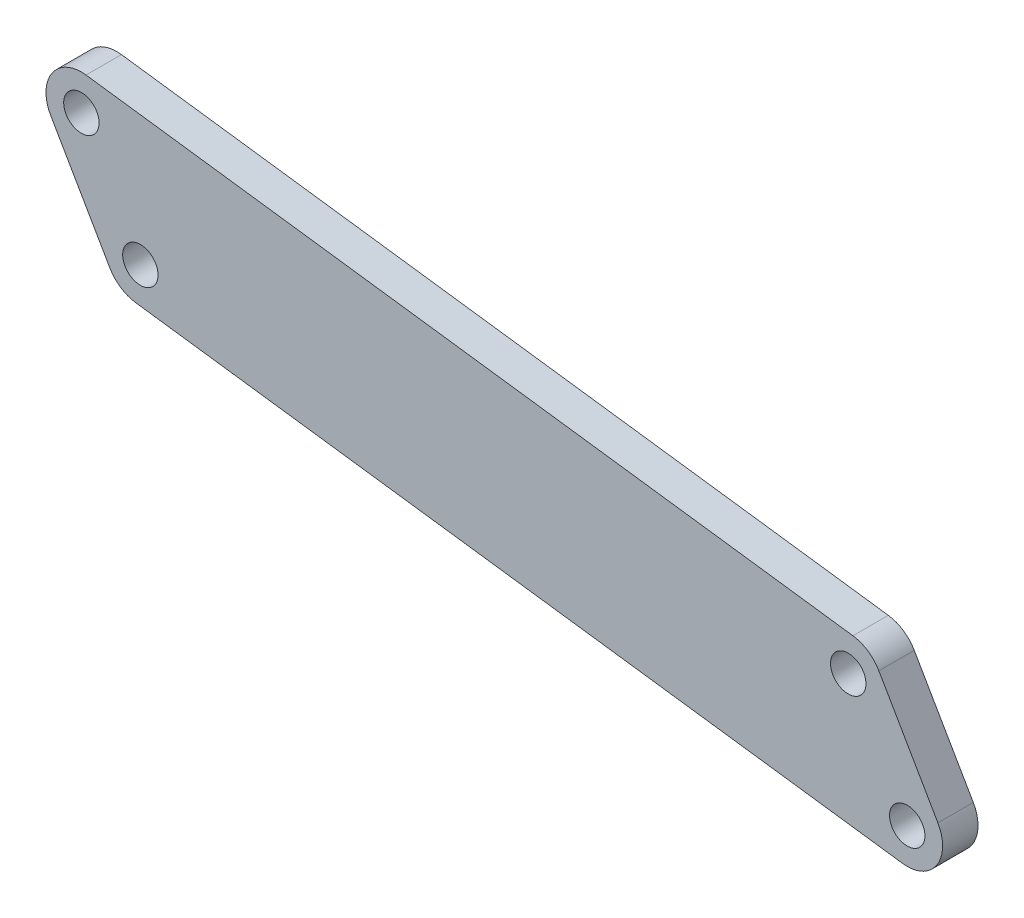
ISO-10303-21;
HEADER;
FILE_DESCRIPTION(('STEP AP214'),'2;1');
FILE_NAME('part.step','',(''),(''),'','','');
FILE_SCHEMA(('AUTOMOTIVE_DESIGN { 1 0 10303 214 1 1 1 1 }'));
ENDSEC;
DATA;
#1=APPLICATION_CONTEXT('core data for automotive mechanical design processes');
#2=APPLICATION_PROTOCOL_DEFINITION('international standard','automotive_design',2000,#1);
#3=PRODUCT_CONTEXT('',#1,'mechanical');
#4=PRODUCT('Part','Part','',(#3));
#5=PRODUCT_RELATED_PRODUCT_CATEGORY('part','',(#4));
#6=PRODUCT_DEFINITION_FORMATION('','',#4);
#7=PRODUCT_DEFINITION_CONTEXT('part definition',#1,'design');
#8=PRODUCT_DEFINITION('design','',#6,#7);
#9=PRODUCT_DEFINITION_SHAPE('','',#8);
#10=(LENGTH_UNIT() NAMED_UNIT(*) SI_UNIT(.MILLI.,.METRE.));
#11=(NAMED_UNIT(*) PLANE_ANGLE_UNIT() SI_UNIT($,.RADIAN.));
#12=(NAMED_UNIT(*) SI_UNIT($,.STERADIAN.) SOLID_ANGLE_UNIT());
#13=UNCERTAINTY_MEASURE_WITH_UNIT(LENGTH_MEASURE(1.E-05),#10,'distance_accuracy_value','');
#14=(GEOMETRIC_REPRESENTATION_CONTEXT(3) GLOBAL_UNCERTAINTY_ASSIGNED_CONTEXT((#13)) GLOBAL_UNIT_ASSIGNED_CONTEXT((#10,
#11,#12)) REPRESENTATION_CONTEXT('',''));
#15=CARTESIAN_POINT('',(0.,0.,0.));
#16=DIRECTION('',(0.,0.,1.));
#17=DIRECTION('',(1.,0.,0.));
#18=AXIS2_PLACEMENT_3D('',#15,#16,#17);
#19=CARTESIAN_POINT('',(-60.,0.,3.));
#20=DIRECTION('',(0.,0.,1.));
#21=DIRECTION('',(1.,0.,0.));
#22=AXIS2_PLACEMENT_3D('',#19,#20,#21);
#23=PLANE('',#22);
#24=CARTESIAN_POINT('',(0.,0.,3.));
#25=DIRECTION('',(0.,0.,1.));
#26=DIRECTION('',(1.,0.,0.));
#27=AXIS2_PLACEMENT_3D('',#24,#25,#26);
#28=CIRCLE('',#27,1.5);
#29=CARTESIAN_POINT('',(1.5,0.,3.));
#30=VERTEX_POINT('',#29);
#31=EDGE_CURVE('E221',#30,#30,#28,.T.);
#32=ORIENTED_EDGE('',*,*,#31,.F.);
#33=EDGE_LOOP('',(#32));
#34=FACE_BOUND('',#33,.T.);
#35=CARTESIAN_POINT('',(-60.,0.,3.));
#36=DIRECTION('',(0.,0.,1.));
#37=DIRECTION('',(1.,0.,0.));
#38=AXIS2_PLACEMENT_3D('',#35,#36,#37);
#39=CIRCLE('',#38,1.5);
#40=CARTESIAN_POINT('',(-58.5,0.,3.));
#41=VERTEX_POINT('',#40);
#42=EDGE_CURVE('E146',#41,#41,#39,.T.);
#43=ORIENTED_EDGE('',*,*,#42,.F.);
#44=EDGE_LOOP('',(#43));
#45=FACE_BOUND('',#44,.T.);
#46=CARTESIAN_POINT('',(-60.,0.,3.));
#47=DIRECTION('',(0.,0.,1.));
#48=DIRECTION('',(1.,0.,0.));
#49=AXIS2_PLACEMENT_3D('',#46,#47,#48);
#50=CIRCLE('',#49,3.);
#51=CARTESIAN_POINT('',(-62.5980762113533,-1.5,3.));
#52=VERTEX_POINT('',#51);
#53=CARTESIAN_POINT('',(-60.3962029078465,-2.97372212148579,3.));
#54=VERTEX_POINT('',#53);
#55=EDGE_CURVE('E164',#52,#54,#50,.T.);
#56=ORIENTED_EDGE('',*,*,#55,.T.);
#57=DIRECTION('',(0.99124070716193,-0.132067635948843,0.));
#58=VECTOR('',#57,1.);
#59=CARTESIAN_POINT('',(4.60379709215352,-11.6339761593302,3.));
#60=LINE('',#59,#58);
#61=CARTESIAN_POINT('',(4.60379709215352,-11.6339761593302,3.));
#62=VERTEX_POINT('',#61);
#63=EDGE_CURVE('E100',#54,#62,#60,.T.);
#64=ORIENTED_EDGE('',*,*,#63,.T.);
#65=CARTESIAN_POINT('',(5.00000000000004,-8.66025403784436,3.));
#66=DIRECTION('',(0.,0.,1.));
#67=DIRECTION('',(1.,0.,0.));
#68=AXIS2_PLACEMENT_3D('',#65,#66,#67);
#69=CIRCLE('',#68,3.);
#70=CARTESIAN_POINT('',(7.59807621135335,-7.16025403784435,3.));
#71=VERTEX_POINT('',#70);
#72=EDGE_CURVE('E185',#62,#71,#69,.T.);
#73=ORIENTED_EDGE('',*,*,#72,.T.);
#74=DIRECTION('',(-0.500000000000004,0.866025403784436,0.));
#75=VECTOR('',#74,1.);
#76=CARTESIAN_POINT('',(2.59807621135331,1.50000000000001,3.));
#77=LINE('',#76,#75);
#78=CARTESIAN_POINT('',(2.59807621135331,1.50000000000001,3.));
#79=VERTEX_POINT('',#78);
#80=EDGE_CURVE('E199',#71,#79,#77,.T.);
#81=ORIENTED_EDGE('',*,*,#80,.T.);
#82=CARTESIAN_POINT('',(0.,0.,3.));
#83=DIRECTION('',(0.,0.,1.));
#84=DIRECTION('',(1.,0.,0.));
#85=AXIS2_PLACEMENT_3D('',#82,#83,#84);
#86=CIRCLE('',#85,3.);
#87=CARTESIAN_POINT('',(0.396202907846531,2.97372212148579,3.));
#88=VERTEX_POINT('',#87);
#89=EDGE_CURVE('E119',#79,#88,#86,.T.);
#90=ORIENTED_EDGE('',*,*,#89,.T.);
#91=DIRECTION('',(-0.99124070716193,0.132067635948844,0.));
#92=VECTOR('',#91,1.);
#93=CARTESIAN_POINT('',(-64.6037970921534,11.6339761593302,3.));
#94=LINE('',#93,#92);
#95=CARTESIAN_POINT('',(-64.6037970921534,11.6339761593302,3.));
#96=VERTEX_POINT('',#95);
#97=EDGE_CURVE('E113',#88,#96,#94,.T.);
#98=ORIENTED_EDGE('',*,*,#97,.T.);
#99=CARTESIAN_POINT('',(-65.,8.66025403784439,3.));
#100=DIRECTION('',(0.,0.,1.));
#101=DIRECTION('',(1.,0.,0.));
#102=AXIS2_PLACEMENT_3D('',#99,#100,#101);
#103=CIRCLE('',#102,3.00000000000001);
#104=CARTESIAN_POINT('',(-67.5980762113533,7.16025403784439,3.));
#105=VERTEX_POINT('',#104);
#106=EDGE_CURVE('E117',#96,#105,#103,.T.);
#107=ORIENTED_EDGE('',*,*,#106,.T.);
#108=DIRECTION('',(0.499999999999999,-0.866025403784439,0.));
#109=VECTOR('',#108,1.);
#110=CARTESIAN_POINT('',(-62.5980762113533,-1.5,3.));
#111=LINE('',#110,#109);
#112=EDGE_CURVE('E57',#105,#52,#111,.T.);
#113=ORIENTED_EDGE('',*,*,#112,.T.);
#114=EDGE_LOOP('',(#56,#64,#73,#81,#90,#98,#107,#113));
#115=FACE_BOUND('',#114,.T.);
#116=CARTESIAN_POINT('',(-65.,8.66025403784439,3.));
#117=DIRECTION('',(0.,0.,1.));
#118=DIRECTION('',(1.,0.,0.));
#119=AXIS2_PLACEMENT_3D('',#116,#117,#118);
#120=CIRCLE('',#119,1.5);
#121=CARTESIAN_POINT('',(-63.5,8.66025403784439,3.));
#122=VERTEX_POINT('',#121);
#123=EDGE_CURVE('E213',#122,#122,#120,.T.);
#124=ORIENTED_EDGE('',*,*,#123,.F.);
#125=EDGE_LOOP('',(#124));
#126=FACE_BOUND('',#125,.T.);
#127=CARTESIAN_POINT('',(5.00000000000004,-8.66025403784436,3.));
#128=DIRECTION('',(0.,0.,1.));
#129=DIRECTION('',(1.,0.,0.));
#130=AXIS2_PLACEMENT_3D('',#127,#128,#129);
#131=CIRCLE('',#130,1.5);
#132=CARTESIAN_POINT('',(6.50000000000004,-8.66025403784436,3.));
#133=VERTEX_POINT('',#132);
#134=EDGE_CURVE('E229',#133,#133,#131,.T.);
#135=ORIENTED_EDGE('',*,*,#134,.F.);
#136=EDGE_LOOP('',(#135));
#137=FACE_BOUND('',#136,.T.);
#138=ADVANCED_FACE('F39',(#34,#45,#115,#126,#137),#23,.T.);
#139=CARTESIAN_POINT('',(-60.,0.,0.));
#140=DIRECTION('',(0.,0.,1.));
#141=DIRECTION('',(1.,0.,0.));
#142=AXIS2_PLACEMENT_3D('',#139,#140,#141);
#143=PLANE('',#142);
#144=CARTESIAN_POINT('',(-60.,0.,0.));
#145=DIRECTION('',(0.,0.,1.));
#146=DIRECTION('',(1.,0.,0.));
#147=AXIS2_PLACEMENT_3D('',#144,#145,#146);
#148=CIRCLE('',#147,3.);
#149=CARTESIAN_POINT('',(-62.5980762113533,-1.5,0.));
#150=VERTEX_POINT('',#149);
#151=CARTESIAN_POINT('',(-60.3962029078465,-2.97372212148579,0.));
#152=VERTEX_POINT('',#151);
#153=EDGE_CURVE('E141',#150,#152,#148,.T.);
#154=ORIENTED_EDGE('',*,*,#153,.F.);
#155=DIRECTION('',(0.499999999999999,-0.866025403784439,0.));
#156=VECTOR('',#155,1.);
#157=CARTESIAN_POINT('',(-62.5980762113533,-1.5,0.));
#158=LINE('',#157,#156);
#159=CARTESIAN_POINT('',(-67.5980762113533,7.16025403784439,0.));
#160=VERTEX_POINT('',#159);
#161=EDGE_CURVE('E92',#160,#150,#158,.T.);
#162=ORIENTED_EDGE('',*,*,#161,.F.);
#163=CARTESIAN_POINT('',(-65.,8.66025403784439,0.));
#164=DIRECTION('',(0.,0.,1.));
#165=DIRECTION('',(1.,0.,0.));
#166=AXIS2_PLACEMENT_3D('',#163,#164,#165);
#167=CIRCLE('',#166,3.00000000000001);
#168=CARTESIAN_POINT('',(-64.6037970921534,11.6339761593302,0.));
#169=VERTEX_POINT('',#168);
#170=EDGE_CURVE('E86',#169,#160,#167,.T.);
#171=ORIENTED_EDGE('',*,*,#170,.F.);
#172=DIRECTION('',(-0.99124070716193,0.132067635948844,0.));
#173=VECTOR('',#172,1.);
#174=CARTESIAN_POINT('',(-64.6037970921534,11.6339761593302,0.));
#175=LINE('',#174,#173);
#176=CARTESIAN_POINT('',(0.396202907846531,2.97372212148579,0.));
#177=VERTEX_POINT('',#176);
#178=EDGE_CURVE('E128',#177,#169,#175,.T.);
#179=ORIENTED_EDGE('',*,*,#178,.F.);
#180=CARTESIAN_POINT('',(0.,0.,0.));
#181=DIRECTION('',(0.,0.,1.));
#182=DIRECTION('',(1.,0.,0.));
#183=AXIS2_PLACEMENT_3D('',#180,#181,#182);
#184=CIRCLE('',#183,3.);
#185=CARTESIAN_POINT('',(2.59807621135331,1.50000000000001,0.));
#186=VERTEX_POINT('',#185);
#187=EDGE_CURVE('E155',#186,#177,#184,.T.);
#188=ORIENTED_EDGE('',*,*,#187,.F.);
#189=DIRECTION('',(-0.500000000000004,0.866025403784436,0.));
#190=VECTOR('',#189,1.);
#191=CARTESIAN_POINT('',(2.59807621135331,1.50000000000001,0.));
#192=LINE('',#191,#190);
#193=CARTESIAN_POINT('',(7.59807621135335,-7.16025403784435,0.));
#194=VERTEX_POINT('',#193);
#195=EDGE_CURVE('E152',#194,#186,#192,.T.);
#196=ORIENTED_EDGE('',*,*,#195,.F.);
#197=CARTESIAN_POINT('',(5.00000000000004,-8.66025403784436,0.));
#198=DIRECTION('',(0.,0.,1.));
#199=DIRECTION('',(1.,0.,0.));
#200=AXIS2_PLACEMENT_3D('',#197,#198,#199);
#201=CIRCLE('',#200,3.);
#202=CARTESIAN_POINT('',(4.60379709215352,-11.6339761593302,0.));
#203=VERTEX_POINT('',#202);
#204=EDGE_CURVE('E149',#203,#194,#201,.T.);
#205=ORIENTED_EDGE('',*,*,#204,.F.);
#206=DIRECTION('',(0.99124070716193,-0.132067635948843,0.));
#207=VECTOR('',#206,1.);
#208=CARTESIAN_POINT('',(4.60379709215352,-11.6339761593302,0.));
#209=LINE('',#208,#207);
#210=EDGE_CURVE('E145',#152,#203,#209,.T.);
#211=ORIENTED_EDGE('',*,*,#210,.F.);
#212=EDGE_LOOP('',(#154,#162,#171,#179,#188,#196,#205,#211));
#213=FACE_BOUND('',#212,.T.);
#214=CARTESIAN_POINT('',(-60.,0.,0.));
#215=DIRECTION('',(0.,0.,1.));
#216=DIRECTION('',(1.,0.,0.));
#217=AXIS2_PLACEMENT_3D('',#214,#215,#216);
#218=CIRCLE('',#217,1.5);
#219=CARTESIAN_POINT('',(-58.5,0.,0.));
#220=VERTEX_POINT('',#219);
#221=EDGE_CURVE('E209',#220,#220,#218,.T.);
#222=ORIENTED_EDGE('',*,*,#221,.T.);
#223=EDGE_LOOP('',(#222));
#224=FACE_BOUND('',#223,.T.);
#225=CARTESIAN_POINT('',(-65.,8.66025403784439,0.));
#226=DIRECTION('',(0.,0.,1.));
#227=DIRECTION('',(1.,0.,0.));
#228=AXIS2_PLACEMENT_3D('',#225,#226,#227);
#229=CIRCLE('',#228,1.5);
#230=CARTESIAN_POINT('',(-63.5,8.66025403784439,0.));
#231=VERTEX_POINT('',#230);
#232=EDGE_CURVE('E217',#231,#231,#229,.T.);
#233=ORIENTED_EDGE('',*,*,#232,.T.);
#234=EDGE_LOOP('',(#233));
#235=FACE_BOUND('',#234,.T.);
#236=CARTESIAN_POINT('',(0.,0.,0.));
#237=DIRECTION('',(0.,0.,1.));
#238=DIRECTION('',(1.,0.,0.));
#239=AXIS2_PLACEMENT_3D('',#236,#237,#238);
#240=CIRCLE('',#239,1.5);
#241=CARTESIAN_POINT('',(1.5,0.,0.));
#242=VERTEX_POINT('',#241);
#243=EDGE_CURVE('E225',#242,#242,#240,.T.);
#244=ORIENTED_EDGE('',*,*,#243,.T.);
#245=EDGE_LOOP('',(#244));
#246=FACE_BOUND('',#245,.T.);
#247=CARTESIAN_POINT('',(5.00000000000004,-8.66025403784436,0.));
#248=DIRECTION('',(0.,0.,1.));
#249=DIRECTION('',(1.,0.,0.));
#250=AXIS2_PLACEMENT_3D('',#247,#248,#249);
#251=CIRCLE('',#250,1.5);
#252=CARTESIAN_POINT('',(6.50000000000004,-8.66025403784436,0.));
#253=VERTEX_POINT('',#252);
#254=EDGE_CURVE('E233',#253,#253,#251,.T.);
#255=ORIENTED_EDGE('',*,*,#254,.T.);
#256=EDGE_LOOP('',(#255));
#257=FACE_BOUND('',#256,.T.);
#258=ADVANCED_FACE('F189',(#213,#224,#235,#246,#257),#143,.F.);
#259=CARTESIAN_POINT('',(-60.,0.,3.));
#260=DIRECTION('',(0.,0.,-1.));
#261=DIRECTION('',(-1.,0.,0.));
#262=AXIS2_PLACEMENT_3D('',#259,#260,#261);
#263=CYLINDRICAL_SURFACE('',#262,3.);
#264=ORIENTED_EDGE('',*,*,#153,.T.);
#265=DIRECTION('',(0.,0.,-1.));
#266=VECTOR('',#265,1.);
#267=CARTESIAN_POINT('',(-60.3962029078465,-2.97372212148579,3.));
#268=LINE('',#267,#266);
#269=EDGE_CURVE('E11',#54,#152,#268,.T.);
#270=ORIENTED_EDGE('',*,*,#269,.F.);
#271=ORIENTED_EDGE('',*,*,#55,.F.);
#272=DIRECTION('',(0.,0.,-1.));
#273=VECTOR('',#272,1.);
#274=CARTESIAN_POINT('',(-62.5980762113533,-1.5,3.));
#275=LINE('',#274,#273);
#276=EDGE_CURVE('E137',#52,#150,#275,.T.);
#277=ORIENTED_EDGE('',*,*,#276,.T.);
#278=EDGE_LOOP('',(#264,#270,#271,#277));
#279=FACE_BOUND('',#278,.T.);
#280=ADVANCED_FACE('F41',(#279),#263,.T.);
#281=CARTESIAN_POINT('',(4.60379709215352,-11.6339761593302,3.));
#282=DIRECTION('',(0.132067635948843,0.99124070716193,0.));
#283=DIRECTION('',(-0.99124070716193,0.132067635948843,0.));
#284=AXIS2_PLACEMENT_3D('',#281,#282,#283);
#285=PLANE('',#284);
#286=ORIENTED_EDGE('',*,*,#210,.T.);
#287=DIRECTION('',(0.,0.,-1.));
#288=VECTOR('',#287,1.);
#289=CARTESIAN_POINT('',(4.60379709215352,-11.6339761593302,3.));
#290=LINE('',#289,#288);
#291=EDGE_CURVE('E49',#62,#203,#290,.T.);
#292=ORIENTED_EDGE('',*,*,#291,.F.);
#293=ORIENTED_EDGE('',*,*,#63,.F.);
#294=ORIENTED_EDGE('',*,*,#269,.T.);
#295=EDGE_LOOP('',(#286,#292,#293,#294));
#296=FACE_BOUND('',#295,.T.);
#297=ADVANCED_FACE('F269',(#296),#285,.F.);
#298=CARTESIAN_POINT('',(5.00000000000004,-8.66025403784436,3.));
#299=DIRECTION('',(0.,0.,-1.));
#300=DIRECTION('',(-1.,0.,0.));
#301=AXIS2_PLACEMENT_3D('',#298,#299,#300);
#302=CYLINDRICAL_SURFACE('',#301,3.);
#303=ORIENTED_EDGE('',*,*,#204,.T.);
#304=DIRECTION('',(0.,0.,-1.));
#305=VECTOR('',#304,1.);
#306=CARTESIAN_POINT('',(7.59807621135335,-7.16025403784435,3.));
#307=LINE('',#306,#305);
#308=EDGE_CURVE('E175',#71,#194,#307,.T.);
#309=ORIENTED_EDGE('',*,*,#308,.F.);
#310=ORIENTED_EDGE('',*,*,#72,.F.);
#311=ORIENTED_EDGE('',*,*,#291,.T.);
#312=EDGE_LOOP('',(#303,#309,#310,#311));
#313=FACE_BOUND('',#312,.T.);
#314=ADVANCED_FACE('F183',(#313),#302,.T.);
#315=CARTESIAN_POINT('',(2.59807621135331,1.50000000000001,3.));
#316=DIRECTION('',(-0.866025403784436,-0.500000000000004,0.));
#317=DIRECTION('',(0.500000000000004,-0.866025403784436,0.));
#318=AXIS2_PLACEMENT_3D('',#315,#316,#317);
#319=PLANE('',#318);
#320=ORIENTED_EDGE('',*,*,#195,.T.);
#321=DIRECTION('',(0.,0.,-1.));
#322=VECTOR('',#321,1.);
#323=CARTESIAN_POINT('',(2.59807621135331,1.50000000000001,3.));
#324=LINE('',#323,#322);
#325=EDGE_CURVE('E171',#79,#186,#324,.T.);
#326=ORIENTED_EDGE('',*,*,#325,.F.);
#327=ORIENTED_EDGE('',*,*,#80,.F.);
#328=ORIENTED_EDGE('',*,*,#308,.T.);
#329=EDGE_LOOP('',(#320,#326,#327,#328));
#330=FACE_BOUND('',#329,.T.);
#331=ADVANCED_FACE('F194',(#330),#319,.F.);
#332=CARTESIAN_POINT('',(0.,0.,3.));
#333=DIRECTION('',(0.,0.,-1.));
#334=DIRECTION('',(-1.,0.,0.));
#335=AXIS2_PLACEMENT_3D('',#332,#333,#334);
#336=CYLINDRICAL_SURFACE('',#335,3.);
#337=ORIENTED_EDGE('',*,*,#187,.T.);
#338=DIRECTION('',(0.,0.,-1.));
#339=VECTOR('',#338,1.);
#340=CARTESIAN_POINT('',(0.396202907846531,2.97372212148579,3.));
#341=LINE('',#340,#339);
#342=EDGE_CURVE('E130',#88,#177,#341,.T.);
#343=ORIENTED_EDGE('',*,*,#342,.F.);
#344=ORIENTED_EDGE('',*,*,#89,.F.);
#345=ORIENTED_EDGE('',*,*,#325,.T.);
#346=EDGE_LOOP('',(#337,#343,#344,#345));
#347=FACE_BOUND('',#346,.T.);
#348=ADVANCED_FACE('F197',(#347),#336,.T.);
#349=CARTESIAN_POINT('',(-64.6037970921534,11.6339761593302,3.));
#350=DIRECTION('',(-0.132067635948844,-0.99124070716193,0.));
#351=DIRECTION('',(0.99124070716193,-0.132067635948844,0.));
#352=AXIS2_PLACEMENT_3D('',#349,#350,#351);
#353=PLANE('',#352);
#354=ORIENTED_EDGE('',*,*,#178,.T.);
#355=DIRECTION('',(0.,0.,-1.));
#356=VECTOR('',#355,1.);
#357=CARTESIAN_POINT('',(-64.6037970921534,11.6339761593302,3.));
#358=LINE('',#357,#356);
#359=EDGE_CURVE('E125',#96,#169,#358,.T.);
#360=ORIENTED_EDGE('',*,*,#359,.F.);
#361=ORIENTED_EDGE('',*,*,#97,.F.);
#362=ORIENTED_EDGE('',*,*,#342,.T.);
#363=EDGE_LOOP('',(#354,#360,#361,#362));
#364=FACE_BOUND('',#363,.T.);
#365=ADVANCED_FACE('F126',(#364),#353,.F.);
#366=CARTESIAN_POINT('',(-65.,8.66025403784439,3.));
#367=DIRECTION('',(0.,0.,-1.));
#368=DIRECTION('',(-1.,0.,0.));
#369=AXIS2_PLACEMENT_3D('',#366,#367,#368);
#370=CYLINDRICAL_SURFACE('',#369,3.00000000000001);
#371=ORIENTED_EDGE('',*,*,#170,.T.);
#372=DIRECTION('',(0.,0.,-1.));
#373=VECTOR('',#372,1.);
#374=CARTESIAN_POINT('',(-67.5980762113533,7.16025403784439,3.));
#375=LINE('',#374,#373);
#376=EDGE_CURVE('E131',#105,#160,#375,.T.);
#377=ORIENTED_EDGE('',*,*,#376,.F.);
#378=ORIENTED_EDGE('',*,*,#106,.F.);
#379=ORIENTED_EDGE('',*,*,#359,.T.);
#380=EDGE_LOOP('',(#371,#377,#378,#379));
#381=FACE_BOUND('',#380,.T.);
#382=ADVANCED_FACE('F133',(#381),#370,.T.);
#383=CARTESIAN_POINT('',(-62.5980762113533,-1.5,3.));
#384=DIRECTION('',(0.866025403784439,0.499999999999999,0.));
#385=DIRECTION('',(-0.499999999999999,0.866025403784439,0.));
#386=AXIS2_PLACEMENT_3D('',#383,#384,#385);
#387=PLANE('',#386);
#388=ORIENTED_EDGE('',*,*,#161,.T.);
#389=ORIENTED_EDGE('',*,*,#276,.F.);
#390=ORIENTED_EDGE('',*,*,#112,.F.);
#391=ORIENTED_EDGE('',*,*,#376,.T.);
#392=EDGE_LOOP('',(#388,#389,#390,#391));
#393=FACE_BOUND('',#392,.T.);
#394=ADVANCED_FACE('F257',(#393),#387,.F.);
#395=CARTESIAN_POINT('',(-60.,0.,3.));
#396=DIRECTION('',(0.,0.,-1.));
#397=DIRECTION('',(-1.,0.,0.));
#398=AXIS2_PLACEMENT_3D('',#395,#396,#397);
#399=CYLINDRICAL_SURFACE('',#398,1.5);
#400=ORIENTED_EDGE('',*,*,#42,.T.);
#401=EDGE_LOOP('',(#400));
#402=FACE_BOUND('',#401,.T.);
#403=ORIENTED_EDGE('',*,*,#221,.F.);
#404=EDGE_LOOP('',(#403));
#405=FACE_BOUND('',#404,.T.);
#406=ADVANCED_FACE('F254',(#402,#405),#399,.F.);
#407=CARTESIAN_POINT('',(-65.,8.66025403784439,3.));
#408=DIRECTION('',(0.,0.,-1.));
#409=DIRECTION('',(-1.,0.,0.));
#410=AXIS2_PLACEMENT_3D('',#407,#408,#409);
#411=CYLINDRICAL_SURFACE('',#410,1.5);
#412=ORIENTED_EDGE('',*,*,#123,.T.);
#413=EDGE_LOOP('',(#412));
#414=FACE_BOUND('',#413,.T.);
#415=ORIENTED_EDGE('',*,*,#232,.F.);
#416=EDGE_LOOP('',(#415));
#417=FACE_BOUND('',#416,.T.);
#418=ADVANCED_FACE('F333',(#414,#417),#411,.F.);
#419=CARTESIAN_POINT('',(0.,0.,3.));
#420=DIRECTION('',(0.,0.,-1.));
#421=DIRECTION('',(-1.,0.,0.));
#422=AXIS2_PLACEMENT_3D('',#419,#420,#421);
#423=CYLINDRICAL_SURFACE('',#422,1.5);
#424=ORIENTED_EDGE('',*,*,#31,.T.);
#425=EDGE_LOOP('',(#424));
#426=FACE_BOUND('',#425,.T.);
#427=ORIENTED_EDGE('',*,*,#243,.F.);
#428=EDGE_LOOP('',(#427));
#429=FACE_BOUND('',#428,.T.);
#430=ADVANCED_FACE('F341',(#426,#429),#423,.F.);
#431=CARTESIAN_POINT('',(5.00000000000004,-8.66025403784436,3.));
#432=DIRECTION('',(0.,0.,-1.));
#433=DIRECTION('',(-1.,0.,0.));
#434=AXIS2_PLACEMENT_3D('',#431,#432,#433);
#435=CYLINDRICAL_SURFACE('',#434,1.5);
#436=ORIENTED_EDGE('',*,*,#134,.T.);
#437=EDGE_LOOP('',(#436));
#438=FACE_BOUND('',#437,.T.);
#439=ORIENTED_EDGE('',*,*,#254,.F.);
#440=EDGE_LOOP('',(#439));
#441=FACE_BOUND('',#440,.T.);
#442=ADVANCED_FACE('F241',(#438,#441),#435,.F.);
#443=CLOSED_SHELL('',(#138,#258,#280,#297,#314,#331,#348,#365,#382,#394,#406,#418,#430,#442));
#444=MANIFOLD_SOLID_BREP('B2',#443);
#445=ADVANCED_BREP_SHAPE_REPRESENTATION('',(#18,#444),#14);
#446=SHAPE_DEFINITION_REPRESENTATION(#9,#445);
ENDSEC;
END-ISO-10303-21;
